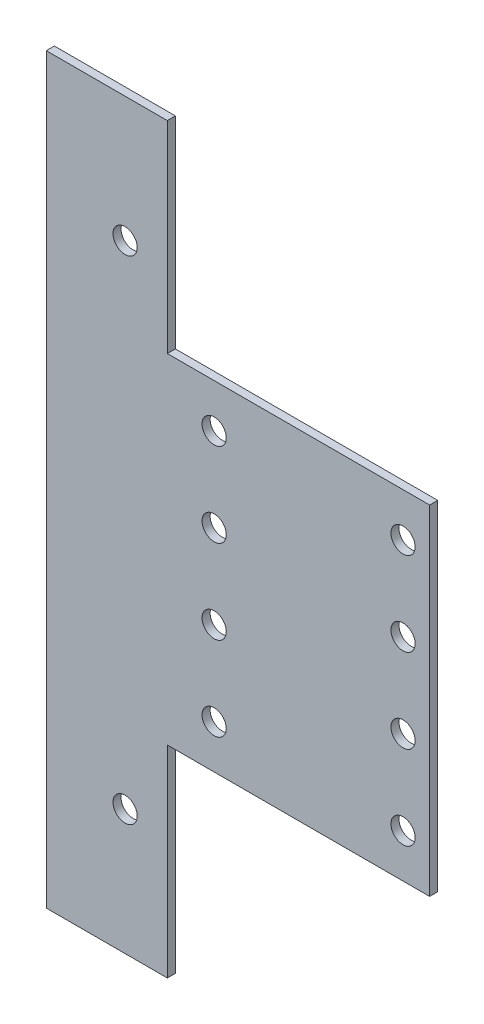
ISO-10303-21;
HEADER;
FILE_DESCRIPTION(('STEP AP214'),'2;1');
FILE_NAME('part.step','',(''),(''),'','','');
FILE_SCHEMA(('AUTOMOTIVE_DESIGN { 1 0 10303 214 1 1 1 1 }'));
ENDSEC;
DATA;
#1=APPLICATION_CONTEXT('core data for automotive mechanical design processes');
#2=APPLICATION_PROTOCOL_DEFINITION('international standard','automotive_design',2000,#1);
#3=PRODUCT_CONTEXT('',#1,'mechanical');
#4=PRODUCT('Part','Part','',(#3));
#5=PRODUCT_RELATED_PRODUCT_CATEGORY('part','',(#4));
#6=PRODUCT_DEFINITION_FORMATION('','',#4);
#7=PRODUCT_DEFINITION_CONTEXT('part definition',#1,'design');
#8=PRODUCT_DEFINITION('design','',#6,#7);
#9=PRODUCT_DEFINITION_SHAPE('','',#8);
#10=(LENGTH_UNIT() NAMED_UNIT(*) SI_UNIT(.MILLI.,.METRE.));
#11=(NAMED_UNIT(*) PLANE_ANGLE_UNIT() SI_UNIT($,.RADIAN.));
#12=(NAMED_UNIT(*) SI_UNIT($,.STERADIAN.) SOLID_ANGLE_UNIT());
#13=UNCERTAINTY_MEASURE_WITH_UNIT(LENGTH_MEASURE(1.E-05),#10,'distance_accuracy_value','');
#14=(GEOMETRIC_REPRESENTATION_CONTEXT(3) GLOBAL_UNCERTAINTY_ASSIGNED_CONTEXT((#13)) GLOBAL_UNIT_ASSIGNED_CONTEXT((#10,
#11,#12)) REPRESENTATION_CONTEXT('',''));
#15=CARTESIAN_POINT('',(0.,0.,0.));
#16=DIRECTION('',(0.,0.,1.));
#17=DIRECTION('',(1.,0.,0.));
#18=AXIS2_PLACEMENT_3D('',#15,#16,#17);
#19=CARTESIAN_POINT('',(0.,0.,1.));
#20=DIRECTION('',(0.,0.,-1.));
#21=DIRECTION('',(-1.,0.,0.));
#22=AXIS2_PLACEMENT_3D('',#19,#20,#21);
#23=PLANE('',#22);
#24=DIRECTION('',(-1.,0.,0.));
#25=VECTOR('',#24,1.);
#26=CARTESIAN_POINT('',(23.75,21.,1.));
#27=LINE('',#26,#25);
#28=CARTESIAN_POINT('',(23.75,21.,1.));
#29=VERTEX_POINT('',#28);
#30=CARTESIAN_POINT('',(-8.74999999999999,21.,1.));
#31=VERTEX_POINT('',#30);
#32=EDGE_CURVE('E145',#29,#31,#27,.T.);
#33=ORIENTED_EDGE('',*,*,#32,.T.);
#34=DIRECTION('',(0.,1.,0.));
#35=VECTOR('',#34,1.);
#36=CARTESIAN_POINT('',(-8.74999999999999,21.,1.));
#37=LINE('',#36,#35);
#38=CARTESIAN_POINT('',(-8.74999999999999,46.,1.));
#39=VERTEX_POINT('',#38);
#40=EDGE_CURVE('E93',#31,#39,#37,.T.);
#41=ORIENTED_EDGE('',*,*,#40,.T.);
#42=DIRECTION('',(-1.,0.,0.));
#43=VECTOR('',#42,1.);
#44=CARTESIAN_POINT('',(-8.74999999999999,46.,1.));
#45=LINE('',#44,#43);
#46=CARTESIAN_POINT('',(-23.75,46.,1.));
#47=VERTEX_POINT('',#46);
#48=EDGE_CURVE('E160',#39,#47,#45,.T.);
#49=ORIENTED_EDGE('',*,*,#48,.T.);
#50=DIRECTION('',(0.,-1.,0.));
#51=VECTOR('',#50,1.);
#52=CARTESIAN_POINT('',(-23.75,46.,1.));
#53=LINE('',#52,#51);
#54=CARTESIAN_POINT('',(-23.75,-46.,1.));
#55=VERTEX_POINT('',#54);
#56=EDGE_CURVE('E173',#47,#55,#53,.T.);
#57=ORIENTED_EDGE('',*,*,#56,.T.);
#58=DIRECTION('',(1.,0.,0.));
#59=VECTOR('',#58,1.);
#60=CARTESIAN_POINT('',(-23.75,-46.,1.));
#61=LINE('',#60,#59);
#62=CARTESIAN_POINT('',(-8.74999999999999,-46.,1.));
#63=VERTEX_POINT('',#62);
#64=EDGE_CURVE('E112',#55,#63,#61,.T.);
#65=ORIENTED_EDGE('',*,*,#64,.T.);
#66=DIRECTION('',(0.,1.,0.));
#67=VECTOR('',#66,1.);
#68=CARTESIAN_POINT('',(-8.74999999999999,-46.,1.));
#69=LINE('',#68,#67);
#70=CARTESIAN_POINT('',(-8.74999999999999,-21.,1.));
#71=VERTEX_POINT('',#70);
#72=EDGE_CURVE('E106',#63,#71,#69,.T.);
#73=ORIENTED_EDGE('',*,*,#72,.T.);
#74=DIRECTION('',(1.,0.,0.));
#75=VECTOR('',#74,1.);
#76=CARTESIAN_POINT('',(-8.74999999999999,-21.,1.));
#77=LINE('',#76,#75);
#78=CARTESIAN_POINT('',(23.75,-21.,1.));
#79=VERTEX_POINT('',#78);
#80=EDGE_CURVE('E110',#71,#79,#77,.T.);
#81=ORIENTED_EDGE('',*,*,#80,.T.);
#82=DIRECTION('',(0.,1.,0.));
#83=VECTOR('',#82,1.);
#84=CARTESIAN_POINT('',(23.75,-21.,1.));
#85=LINE('',#84,#83);
#86=EDGE_CURVE('E50',#79,#29,#85,.T.);
#87=ORIENTED_EDGE('',*,*,#86,.T.);
#88=EDGE_LOOP('',(#33,#41,#49,#57,#65,#73,#81,#87));
#89=FACE_BOUND('',#88,.T.);
#90=CARTESIAN_POINT('',(-13.9867023110329,30.5,1.));
#91=DIRECTION('',(0.,0.,1.));
#92=DIRECTION('',(1.,0.,0.));
#93=AXIS2_PLACEMENT_3D('',#90,#91,#92);
#94=CIRCLE('',#93,1.5);
#95=CARTESIAN_POINT('',(-12.4867023110329,30.5,1.));
#96=VERTEX_POINT('',#95);
#97=EDGE_CURVE('E134',#96,#96,#94,.T.);
#98=ORIENTED_EDGE('',*,*,#97,.F.);
#99=EDGE_LOOP('',(#98));
#100=FACE_BOUND('',#99,.T.);
#101=CARTESIAN_POINT('',(-13.9867023110329,-30.5,1.));
#102=DIRECTION('',(0.,0.,1.));
#103=DIRECTION('',(1.,0.,0.));
#104=AXIS2_PLACEMENT_3D('',#101,#102,#103);
#105=CIRCLE('',#104,1.5);
#106=CARTESIAN_POINT('',(-12.4867023110329,-30.5,1.));
#107=VERTEX_POINT('',#106);
#108=EDGE_CURVE('E182',#107,#107,#105,.T.);
#109=ORIENTED_EDGE('',*,*,#108,.F.);
#110=EDGE_LOOP('',(#109));
#111=FACE_BOUND('',#110,.T.);
#112=CARTESIAN_POINT('',(-2.94999999999999,-15.6,1.));
#113=DIRECTION('',(0.,0.,1.));
#114=DIRECTION('',(1.,0.,0.));
#115=AXIS2_PLACEMENT_3D('',#112,#113,#114);
#116=CIRCLE('',#115,1.5);
#117=CARTESIAN_POINT('',(-1.44999999999999,-15.6,1.));
#118=VERTEX_POINT('',#117);
#119=EDGE_CURVE('E188',#118,#118,#116,.T.);
#120=ORIENTED_EDGE('',*,*,#119,.F.);
#121=EDGE_LOOP('',(#120));
#122=FACE_BOUND('',#121,.T.);
#123=CARTESIAN_POINT('',(-2.94999999999999,-5.19999999999999,1.));
#124=DIRECTION('',(0.,0.,1.));
#125=DIRECTION('',(1.,0.,0.));
#126=AXIS2_PLACEMENT_3D('',#123,#124,#125);
#127=CIRCLE('',#126,1.5);
#128=CARTESIAN_POINT('',(-1.44999999999999,-5.19999999999999,1.));
#129=VERTEX_POINT('',#128);
#130=EDGE_CURVE('E194',#129,#129,#127,.T.);
#131=ORIENTED_EDGE('',*,*,#130,.F.);
#132=EDGE_LOOP('',(#131));
#133=FACE_BOUND('',#132,.T.);
#134=CARTESIAN_POINT('',(-2.94999999999999,5.20000000000001,1.));
#135=DIRECTION('',(0.,0.,1.));
#136=DIRECTION('',(1.,0.,0.));
#137=AXIS2_PLACEMENT_3D('',#134,#135,#136);
#138=CIRCLE('',#137,1.5);
#139=CARTESIAN_POINT('',(-1.44999999999999,5.20000000000001,1.));
#140=VERTEX_POINT('',#139);
#141=EDGE_CURVE('E200',#140,#140,#138,.T.);
#142=ORIENTED_EDGE('',*,*,#141,.F.);
#143=EDGE_LOOP('',(#142));
#144=FACE_BOUND('',#143,.T.);
#145=CARTESIAN_POINT('',(-2.94999999999999,15.6,1.));
#146=DIRECTION('',(0.,0.,1.));
#147=DIRECTION('',(1.,0.,0.));
#148=AXIS2_PLACEMENT_3D('',#145,#146,#147);
#149=CIRCLE('',#148,1.5);
#150=CARTESIAN_POINT('',(-1.44999999999999,15.6,1.));
#151=VERTEX_POINT('',#150);
#152=EDGE_CURVE('E206',#151,#151,#149,.T.);
#153=ORIENTED_EDGE('',*,*,#152,.F.);
#154=EDGE_LOOP('',(#153));
#155=FACE_BOUND('',#154,.T.);
#156=CARTESIAN_POINT('',(20.45,15.6,1.));
#157=DIRECTION('',(0.,0.,1.));
#158=DIRECTION('',(1.,0.,0.));
#159=AXIS2_PLACEMENT_3D('',#156,#157,#158);
#160=CIRCLE('',#159,1.5);
#161=CARTESIAN_POINT('',(21.95,15.6,1.));
#162=VERTEX_POINT('',#161);
#163=EDGE_CURVE('E212',#162,#162,#160,.T.);
#164=ORIENTED_EDGE('',*,*,#163,.F.);
#165=EDGE_LOOP('',(#164));
#166=FACE_BOUND('',#165,.T.);
#167=CARTESIAN_POINT('',(20.45,5.2,1.));
#168=DIRECTION('',(0.,0.,1.));
#169=DIRECTION('',(1.,0.,0.));
#170=AXIS2_PLACEMENT_3D('',#167,#168,#169);
#171=CIRCLE('',#170,1.5);
#172=CARTESIAN_POINT('',(21.95,5.2,1.));
#173=VERTEX_POINT('',#172);
#174=EDGE_CURVE('E218',#173,#173,#171,.T.);
#175=ORIENTED_EDGE('',*,*,#174,.F.);
#176=EDGE_LOOP('',(#175));
#177=FACE_BOUND('',#176,.T.);
#178=CARTESIAN_POINT('',(20.45,-5.2,1.));
#179=DIRECTION('',(0.,0.,1.));
#180=DIRECTION('',(1.,0.,0.));
#181=AXIS2_PLACEMENT_3D('',#178,#179,#180);
#182=CIRCLE('',#181,1.5);
#183=CARTESIAN_POINT('',(21.95,-5.2,1.));
#184=VERTEX_POINT('',#183);
#185=EDGE_CURVE('E224',#184,#184,#182,.T.);
#186=ORIENTED_EDGE('',*,*,#185,.F.);
#187=EDGE_LOOP('',(#186));
#188=FACE_BOUND('',#187,.T.);
#189=CARTESIAN_POINT('',(20.45,-15.6,1.));
#190=DIRECTION('',(0.,0.,1.));
#191=DIRECTION('',(1.,0.,0.));
#192=AXIS2_PLACEMENT_3D('',#189,#190,#191);
#193=CIRCLE('',#192,1.5);
#194=CARTESIAN_POINT('',(21.95,-15.6,1.));
#195=VERTEX_POINT('',#194);
#196=EDGE_CURVE('E230',#195,#195,#193,.T.);
#197=ORIENTED_EDGE('',*,*,#196,.F.);
#198=EDGE_LOOP('',(#197));
#199=FACE_BOUND('',#198,.T.);
#200=ADVANCED_FACE('F33',(#89,#100,#111,#122,#133,#144,#155,#166,#177,#188,#199),#23,.F.);
#201=CARTESIAN_POINT('',(0.,0.,0.));
#202=DIRECTION('',(0.,0.,-1.));
#203=DIRECTION('',(-1.,0.,0.));
#204=AXIS2_PLACEMENT_3D('',#201,#202,#203);
#205=PLANE('',#204);
#206=CARTESIAN_POINT('',(20.45,-5.2,0.));
#207=DIRECTION('',(0.,0.,1.));
#208=DIRECTION('',(1.,0.,0.));
#209=AXIS2_PLACEMENT_3D('',#206,#207,#208);
#210=CIRCLE('',#209,1.5);
#211=CARTESIAN_POINT('',(21.95,-5.2,0.));
#212=VERTEX_POINT('',#211);
#213=EDGE_CURVE('E227',#212,#212,#210,.T.);
#214=ORIENTED_EDGE('',*,*,#213,.T.);
#215=EDGE_LOOP('',(#214));
#216=FACE_BOUND('',#215,.T.);
#217=CARTESIAN_POINT('',(20.45,15.6,0.));
#218=DIRECTION('',(0.,0.,1.));
#219=DIRECTION('',(1.,0.,0.));
#220=AXIS2_PLACEMENT_3D('',#217,#218,#219);
#221=CIRCLE('',#220,1.5);
#222=CARTESIAN_POINT('',(21.95,15.6,0.));
#223=VERTEX_POINT('',#222);
#224=EDGE_CURVE('E215',#223,#223,#221,.T.);
#225=ORIENTED_EDGE('',*,*,#224,.T.);
#226=EDGE_LOOP('',(#225));
#227=FACE_BOUND('',#226,.T.);
#228=CARTESIAN_POINT('',(-2.94999999999999,5.20000000000001,0.));
#229=DIRECTION('',(0.,0.,1.));
#230=DIRECTION('',(1.,0.,0.));
#231=AXIS2_PLACEMENT_3D('',#228,#229,#230);
#232=CIRCLE('',#231,1.5);
#233=CARTESIAN_POINT('',(-1.44999999999999,5.20000000000001,0.));
#234=VERTEX_POINT('',#233);
#235=EDGE_CURVE('E203',#234,#234,#232,.T.);
#236=ORIENTED_EDGE('',*,*,#235,.T.);
#237=EDGE_LOOP('',(#236));
#238=FACE_BOUND('',#237,.T.);
#239=CARTESIAN_POINT('',(-2.94999999999999,-15.6,0.));
#240=DIRECTION('',(0.,0.,1.));
#241=DIRECTION('',(1.,0.,0.));
#242=AXIS2_PLACEMENT_3D('',#239,#240,#241);
#243=CIRCLE('',#242,1.5);
#244=CARTESIAN_POINT('',(-1.44999999999999,-15.6,0.));
#245=VERTEX_POINT('',#244);
#246=EDGE_CURVE('E191',#245,#245,#243,.T.);
#247=ORIENTED_EDGE('',*,*,#246,.T.);
#248=EDGE_LOOP('',(#247));
#249=FACE_BOUND('',#248,.T.);
#250=CARTESIAN_POINT('',(-13.9867023110329,30.5,0.));
#251=DIRECTION('',(0.,0.,1.));
#252=DIRECTION('',(1.,0.,0.));
#253=AXIS2_PLACEMENT_3D('',#250,#251,#252);
#254=CIRCLE('',#253,1.5);
#255=CARTESIAN_POINT('',(-12.4867023110329,30.5,0.));
#256=VERTEX_POINT('',#255);
#257=EDGE_CURVE('E179',#256,#256,#254,.T.);
#258=ORIENTED_EDGE('',*,*,#257,.T.);
#259=EDGE_LOOP('',(#258));
#260=FACE_BOUND('',#259,.T.);
#261=DIRECTION('',(-1.,0.,0.));
#262=VECTOR('',#261,1.);
#263=CARTESIAN_POINT('',(23.75,21.,0.));
#264=LINE('',#263,#262);
#265=CARTESIAN_POINT('',(23.75,21.,0.));
#266=VERTEX_POINT('',#265);
#267=CARTESIAN_POINT('',(-8.74999999999999,21.,0.));
#268=VERTEX_POINT('',#267);
#269=EDGE_CURVE('E130',#266,#268,#264,.T.);
#270=ORIENTED_EDGE('',*,*,#269,.F.);
#271=DIRECTION('',(0.,1.,0.));
#272=VECTOR('',#271,1.);
#273=CARTESIAN_POINT('',(23.75,-21.,0.));
#274=LINE('',#273,#272);
#275=CARTESIAN_POINT('',(23.75,-21.,0.));
#276=VERTEX_POINT('',#275);
#277=EDGE_CURVE('E85',#276,#266,#274,.T.);
#278=ORIENTED_EDGE('',*,*,#277,.F.);
#279=DIRECTION('',(1.,0.,0.));
#280=VECTOR('',#279,1.);
#281=CARTESIAN_POINT('',(-8.74999999999999,-21.,0.));
#282=LINE('',#281,#280);
#283=CARTESIAN_POINT('',(-8.74999999999999,-21.,0.));
#284=VERTEX_POINT('',#283);
#285=EDGE_CURVE('E79',#284,#276,#282,.T.);
#286=ORIENTED_EDGE('',*,*,#285,.F.);
#287=DIRECTION('',(0.,1.,0.));
#288=VECTOR('',#287,1.);
#289=CARTESIAN_POINT('',(-8.74999999999999,-46.,0.));
#290=LINE('',#289,#288);
#291=CARTESIAN_POINT('',(-8.74999999999999,-46.,0.));
#292=VERTEX_POINT('',#291);
#293=EDGE_CURVE('E120',#292,#284,#290,.T.);
#294=ORIENTED_EDGE('',*,*,#293,.F.);
#295=DIRECTION('',(1.,0.,0.));
#296=VECTOR('',#295,1.);
#297=CARTESIAN_POINT('',(-23.75,-46.,0.));
#298=LINE('',#297,#296);
#299=CARTESIAN_POINT('',(-23.75,-46.,0.));
#300=VERTEX_POINT('',#299);
#301=EDGE_CURVE('E140',#300,#292,#298,.T.);
#302=ORIENTED_EDGE('',*,*,#301,.F.);
#303=DIRECTION('',(0.,-1.,0.));
#304=VECTOR('',#303,1.);
#305=CARTESIAN_POINT('',(-23.75,46.,0.));
#306=LINE('',#305,#304);
#307=CARTESIAN_POINT('',(-23.75,46.,0.));
#308=VERTEX_POINT('',#307);
#309=EDGE_CURVE('E138',#308,#300,#306,.T.);
#310=ORIENTED_EDGE('',*,*,#309,.F.);
#311=DIRECTION('',(-1.,0.,0.));
#312=VECTOR('',#311,1.);
#313=CARTESIAN_POINT('',(-8.74999999999999,46.,0.));
#314=LINE('',#313,#312);
#315=CARTESIAN_POINT('',(-8.74999999999999,46.,0.));
#316=VERTEX_POINT('',#315);
#317=EDGE_CURVE('E136',#316,#308,#314,.T.);
#318=ORIENTED_EDGE('',*,*,#317,.F.);
#319=DIRECTION('',(0.,1.,0.));
#320=VECTOR('',#319,1.);
#321=CARTESIAN_POINT('',(-8.74999999999999,21.,0.));
#322=LINE('',#321,#320);
#323=EDGE_CURVE('E133',#268,#316,#322,.T.);
#324=ORIENTED_EDGE('',*,*,#323,.F.);
#325=EDGE_LOOP('',(#270,#278,#286,#294,#302,#310,#318,#324));
#326=FACE_BOUND('',#325,.T.);
#327=CARTESIAN_POINT('',(-13.9867023110329,-30.5,0.));
#328=DIRECTION('',(0.,0.,1.));
#329=DIRECTION('',(1.,0.,0.));
#330=AXIS2_PLACEMENT_3D('',#327,#328,#329);
#331=CIRCLE('',#330,1.5);
#332=CARTESIAN_POINT('',(-12.4867023110329,-30.5,0.));
#333=VERTEX_POINT('',#332);
#334=EDGE_CURVE('E185',#333,#333,#331,.T.);
#335=ORIENTED_EDGE('',*,*,#334,.T.);
#336=EDGE_LOOP('',(#335));
#337=FACE_BOUND('',#336,.T.);
#338=CARTESIAN_POINT('',(-2.94999999999999,-5.19999999999999,0.));
#339=DIRECTION('',(0.,0.,1.));
#340=DIRECTION('',(1.,0.,0.));
#341=AXIS2_PLACEMENT_3D('',#338,#339,#340);
#342=CIRCLE('',#341,1.5);
#343=CARTESIAN_POINT('',(-1.44999999999999,-5.19999999999999,0.));
#344=VERTEX_POINT('',#343);
#345=EDGE_CURVE('E197',#344,#344,#342,.T.);
#346=ORIENTED_EDGE('',*,*,#345,.T.);
#347=EDGE_LOOP('',(#346));
#348=FACE_BOUND('',#347,.T.);
#349=CARTESIAN_POINT('',(-2.94999999999999,15.6,0.));
#350=DIRECTION('',(0.,0.,1.));
#351=DIRECTION('',(1.,0.,0.));
#352=AXIS2_PLACEMENT_3D('',#349,#350,#351);
#353=CIRCLE('',#352,1.5);
#354=CARTESIAN_POINT('',(-1.44999999999999,15.6,0.));
#355=VERTEX_POINT('',#354);
#356=EDGE_CURVE('E209',#355,#355,#353,.T.);
#357=ORIENTED_EDGE('',*,*,#356,.T.);
#358=EDGE_LOOP('',(#357));
#359=FACE_BOUND('',#358,.T.);
#360=CARTESIAN_POINT('',(20.45,5.2,0.));
#361=DIRECTION('',(0.,0.,1.));
#362=DIRECTION('',(1.,0.,0.));
#363=AXIS2_PLACEMENT_3D('',#360,#361,#362);
#364=CIRCLE('',#363,1.5);
#365=CARTESIAN_POINT('',(21.95,5.2,0.));
#366=VERTEX_POINT('',#365);
#367=EDGE_CURVE('E221',#366,#366,#364,.T.);
#368=ORIENTED_EDGE('',*,*,#367,.T.);
#369=EDGE_LOOP('',(#368));
#370=FACE_BOUND('',#369,.T.);
#371=CARTESIAN_POINT('',(20.45,-15.6,0.));
#372=DIRECTION('',(0.,0.,1.));
#373=DIRECTION('',(1.,0.,0.));
#374=AXIS2_PLACEMENT_3D('',#371,#372,#373);
#375=CIRCLE('',#374,1.5);
#376=CARTESIAN_POINT('',(21.95,-15.6,0.));
#377=VERTEX_POINT('',#376);
#378=EDGE_CURVE('E233',#377,#377,#375,.T.);
#379=ORIENTED_EDGE('',*,*,#378,.T.);
#380=EDGE_LOOP('',(#379));
#381=FACE_BOUND('',#380,.T.);
#382=ADVANCED_FACE('F164',(#216,#227,#238,#249,#260,#326,#337,#348,#359,#370,#381),#205,.T.);
#383=CARTESIAN_POINT('',(23.75,21.,1.));
#384=DIRECTION('',(0.,-1.,0.));
#385=DIRECTION('',(0.,0.,-1.));
#386=AXIS2_PLACEMENT_3D('',#383,#384,#385);
#387=PLANE('',#386);
#388=ORIENTED_EDGE('',*,*,#269,.T.);
#389=DIRECTION('',(0.,0.,-1.));
#390=VECTOR('',#389,1.);
#391=CARTESIAN_POINT('',(-8.74999999999999,21.,1.));
#392=LINE('',#391,#390);
#393=EDGE_CURVE('E11',#31,#268,#392,.T.);
#394=ORIENTED_EDGE('',*,*,#393,.F.);
#395=ORIENTED_EDGE('',*,*,#32,.F.);
#396=DIRECTION('',(0.,0.,-1.));
#397=VECTOR('',#396,1.);
#398=CARTESIAN_POINT('',(23.75,21.,1.));
#399=LINE('',#398,#397);
#400=EDGE_CURVE('E126',#29,#266,#399,.T.);
#401=ORIENTED_EDGE('',*,*,#400,.T.);
#402=EDGE_LOOP('',(#388,#394,#395,#401));
#403=FACE_BOUND('',#402,.T.);
#404=ADVANCED_FACE('F35',(#403),#387,.F.);
#405=CARTESIAN_POINT('',(-8.74999999999999,21.,1.));
#406=DIRECTION('',(-1.,0.,0.));
#407=DIRECTION('',(0.,0.,1.));
#408=AXIS2_PLACEMENT_3D('',#405,#406,#407);
#409=PLANE('',#408);
#410=ORIENTED_EDGE('',*,*,#323,.T.);
#411=DIRECTION('',(0.,0.,-1.));
#412=VECTOR('',#411,1.);
#413=CARTESIAN_POINT('',(-8.74999999999999,46.,1.));
#414=LINE('',#413,#412);
#415=EDGE_CURVE('E42',#39,#316,#414,.T.);
#416=ORIENTED_EDGE('',*,*,#415,.F.);
#417=ORIENTED_EDGE('',*,*,#40,.F.);
#418=ORIENTED_EDGE('',*,*,#393,.T.);
#419=EDGE_LOOP('',(#410,#416,#417,#418));
#420=FACE_BOUND('',#419,.T.);
#421=ADVANCED_FACE('F265',(#420),#409,.F.);
#422=CARTESIAN_POINT('',(-8.74999999999999,46.,1.));
#423=DIRECTION('',(0.,-1.,0.));
#424=DIRECTION('',(0.,0.,-1.));
#425=AXIS2_PLACEMENT_3D('',#422,#423,#424);
#426=PLANE('',#425);
#427=ORIENTED_EDGE('',*,*,#317,.T.);
#428=DIRECTION('',(0.,0.,-1.));
#429=VECTOR('',#428,1.);
#430=CARTESIAN_POINT('',(-23.75,46.,1.));
#431=LINE('',#430,#429);
#432=EDGE_CURVE('E152',#47,#308,#431,.T.);
#433=ORIENTED_EDGE('',*,*,#432,.F.);
#434=ORIENTED_EDGE('',*,*,#48,.F.);
#435=ORIENTED_EDGE('',*,*,#415,.T.);
#436=EDGE_LOOP('',(#427,#433,#434,#435));
#437=FACE_BOUND('',#436,.T.);
#438=ADVANCED_FACE('F158',(#437),#426,.F.);
#439=CARTESIAN_POINT('',(-23.75,46.,1.));
#440=DIRECTION('',(1.,0.,0.));
#441=DIRECTION('',(0.,0.,-1.));
#442=AXIS2_PLACEMENT_3D('',#439,#440,#441);
#443=PLANE('',#442);
#444=ORIENTED_EDGE('',*,*,#309,.T.);
#445=DIRECTION('',(0.,0.,-1.));
#446=VECTOR('',#445,1.);
#447=CARTESIAN_POINT('',(-23.75,-46.,1.));
#448=LINE('',#447,#446);
#449=EDGE_CURVE('E149',#55,#300,#448,.T.);
#450=ORIENTED_EDGE('',*,*,#449,.F.);
#451=ORIENTED_EDGE('',*,*,#56,.F.);
#452=ORIENTED_EDGE('',*,*,#432,.T.);
#453=EDGE_LOOP('',(#444,#450,#451,#452));
#454=FACE_BOUND('',#453,.T.);
#455=ADVANCED_FACE('F169',(#454),#443,.F.);
#456=CARTESIAN_POINT('',(-23.75,-46.,1.));
#457=DIRECTION('',(0.,1.,0.));
#458=DIRECTION('',(0.,0.,1.));
#459=AXIS2_PLACEMENT_3D('',#456,#457,#458);
#460=PLANE('',#459);
#461=ORIENTED_EDGE('',*,*,#301,.T.);
#462=DIRECTION('',(0.,0.,-1.));
#463=VECTOR('',#462,1.);
#464=CARTESIAN_POINT('',(-8.74999999999999,-46.,1.));
#465=LINE('',#464,#463);
#466=EDGE_CURVE('E121',#63,#292,#465,.T.);
#467=ORIENTED_EDGE('',*,*,#466,.F.);
#468=ORIENTED_EDGE('',*,*,#64,.F.);
#469=ORIENTED_EDGE('',*,*,#449,.T.);
#470=EDGE_LOOP('',(#461,#467,#468,#469));
#471=FACE_BOUND('',#470,.T.);
#472=ADVANCED_FACE('F172',(#471),#460,.F.);
#473=CARTESIAN_POINT('',(-8.74999999999999,-46.,1.));
#474=DIRECTION('',(-1.,0.,0.));
#475=DIRECTION('',(0.,-1.,0.));
#476=AXIS2_PLACEMENT_3D('',#473,#474,#475);
#477=PLANE('',#476);
#478=ORIENTED_EDGE('',*,*,#293,.T.);
#479=DIRECTION('',(0.,0.,-1.));
#480=VECTOR('',#479,1.);
#481=CARTESIAN_POINT('',(-8.74999999999999,-21.,1.));
#482=LINE('',#481,#480);
#483=EDGE_CURVE('E117',#71,#284,#482,.T.);
#484=ORIENTED_EDGE('',*,*,#483,.F.);
#485=ORIENTED_EDGE('',*,*,#72,.F.);
#486=ORIENTED_EDGE('',*,*,#466,.T.);
#487=EDGE_LOOP('',(#478,#484,#485,#486));
#488=FACE_BOUND('',#487,.T.);
#489=ADVANCED_FACE('F118',(#488),#477,.F.);
#490=CARTESIAN_POINT('',(-8.74999999999999,-21.,1.));
#491=DIRECTION('',(0.,1.,0.));
#492=DIRECTION('',(-1.,0.,0.));
#493=AXIS2_PLACEMENT_3D('',#490,#491,#492);
#494=PLANE('',#493);
#495=ORIENTED_EDGE('',*,*,#285,.T.);
#496=DIRECTION('',(0.,0.,-1.));
#497=VECTOR('',#496,1.);
#498=CARTESIAN_POINT('',(23.75,-21.,1.));
#499=LINE('',#498,#497);
#500=EDGE_CURVE('E122',#79,#276,#499,.T.);
#501=ORIENTED_EDGE('',*,*,#500,.F.);
#502=ORIENTED_EDGE('',*,*,#80,.F.);
#503=ORIENTED_EDGE('',*,*,#483,.T.);
#504=EDGE_LOOP('',(#495,#501,#502,#503));
#505=FACE_BOUND('',#504,.T.);
#506=ADVANCED_FACE('F124',(#505),#494,.F.);
#507=CARTESIAN_POINT('',(23.75,-21.,1.));
#508=DIRECTION('',(-1.,0.,0.));
#509=DIRECTION('',(0.,0.,1.));
#510=AXIS2_PLACEMENT_3D('',#507,#508,#509);
#511=PLANE('',#510);
#512=ORIENTED_EDGE('',*,*,#277,.T.);
#513=ORIENTED_EDGE('',*,*,#400,.F.);
#514=ORIENTED_EDGE('',*,*,#86,.F.);
#515=ORIENTED_EDGE('',*,*,#500,.T.);
#516=EDGE_LOOP('',(#512,#513,#514,#515));
#517=FACE_BOUND('',#516,.T.);
#518=ADVANCED_FACE('F253',(#517),#511,.F.);
#519=CARTESIAN_POINT('',(-13.9867023110329,30.5,1.));
#520=DIRECTION('',(0.,0.,-1.));
#521=DIRECTION('',(-1.,0.,0.));
#522=AXIS2_PLACEMENT_3D('',#519,#520,#521);
#523=CYLINDRICAL_SURFACE('',#522,1.5);
#524=ORIENTED_EDGE('',*,*,#97,.T.);
#525=EDGE_LOOP('',(#524));
#526=FACE_BOUND('',#525,.T.);
#527=ORIENTED_EDGE('',*,*,#257,.F.);
#528=EDGE_LOOP('',(#527));
#529=FACE_BOUND('',#528,.T.);
#530=ADVANCED_FACE('F250',(#526,#529),#523,.F.);
#531=CARTESIAN_POINT('',(-13.9867023110329,-30.5,1.));
#532=DIRECTION('',(0.,0.,-1.));
#533=DIRECTION('',(-1.,0.,0.));
#534=AXIS2_PLACEMENT_3D('',#531,#532,#533);
#535=CYLINDRICAL_SURFACE('',#534,1.5);
#536=ORIENTED_EDGE('',*,*,#108,.T.);
#537=EDGE_LOOP('',(#536));
#538=FACE_BOUND('',#537,.T.);
#539=ORIENTED_EDGE('',*,*,#334,.F.);
#540=EDGE_LOOP('',(#539));
#541=FACE_BOUND('',#540,.T.);
#542=ADVANCED_FACE('F329',(#538,#541),#535,.F.);
#543=CARTESIAN_POINT('',(-2.94999999999999,-15.6,1.));
#544=DIRECTION('',(0.,0.,-1.));
#545=DIRECTION('',(-1.,0.,0.));
#546=AXIS2_PLACEMENT_3D('',#543,#544,#545);
#547=CYLINDRICAL_SURFACE('',#546,1.5);
#548=ORIENTED_EDGE('',*,*,#119,.T.);
#549=EDGE_LOOP('',(#548));
#550=FACE_BOUND('',#549,.T.);
#551=ORIENTED_EDGE('',*,*,#246,.F.);
#552=EDGE_LOOP('',(#551));
#553=FACE_BOUND('',#552,.T.);
#554=ADVANCED_FACE('F337',(#550,#553),#547,.F.);
#555=CARTESIAN_POINT('',(-2.94999999999999,-5.19999999999999,1.));
#556=DIRECTION('',(0.,0.,-1.));
#557=DIRECTION('',(-1.,0.,0.));
#558=AXIS2_PLACEMENT_3D('',#555,#556,#557);
#559=CYLINDRICAL_SURFACE('',#558,1.5);
#560=ORIENTED_EDGE('',*,*,#130,.T.);
#561=EDGE_LOOP('',(#560));
#562=FACE_BOUND('',#561,.T.);
#563=ORIENTED_EDGE('',*,*,#345,.F.);
#564=EDGE_LOOP('',(#563));
#565=FACE_BOUND('',#564,.T.);
#566=ADVANCED_FACE('F345',(#562,#565),#559,.F.);
#567=CARTESIAN_POINT('',(-2.94999999999999,5.20000000000001,1.));
#568=DIRECTION('',(0.,0.,-1.));
#569=DIRECTION('',(-1.,0.,0.));
#570=AXIS2_PLACEMENT_3D('',#567,#568,#569);
#571=CYLINDRICAL_SURFACE('',#570,1.5);
#572=ORIENTED_EDGE('',*,*,#141,.T.);
#573=EDGE_LOOP('',(#572));
#574=FACE_BOUND('',#573,.T.);
#575=ORIENTED_EDGE('',*,*,#235,.F.);
#576=EDGE_LOOP('',(#575));
#577=FACE_BOUND('',#576,.T.);
#578=ADVANCED_FACE('F354',(#574,#577),#571,.F.);
#579=CARTESIAN_POINT('',(-2.94999999999999,15.6,1.));
#580=DIRECTION('',(0.,0.,-1.));
#581=DIRECTION('',(-1.,0.,0.));
#582=AXIS2_PLACEMENT_3D('',#579,#580,#581);
#583=CYLINDRICAL_SURFACE('',#582,1.5);
#584=ORIENTED_EDGE('',*,*,#152,.T.);
#585=EDGE_LOOP('',(#584));
#586=FACE_BOUND('',#585,.T.);
#587=ORIENTED_EDGE('',*,*,#356,.F.);
#588=EDGE_LOOP('',(#587));
#589=FACE_BOUND('',#588,.T.);
#590=ADVANCED_FACE('F363',(#586,#589),#583,.F.);
#591=CARTESIAN_POINT('',(20.45,15.6,1.));
#592=DIRECTION('',(0.,0.,-1.));
#593=DIRECTION('',(-1.,0.,0.));
#594=AXIS2_PLACEMENT_3D('',#591,#592,#593);
#595=CYLINDRICAL_SURFACE('',#594,1.5);
#596=ORIENTED_EDGE('',*,*,#163,.T.);
#597=EDGE_LOOP('',(#596));
#598=FACE_BOUND('',#597,.T.);
#599=ORIENTED_EDGE('',*,*,#224,.F.);
#600=EDGE_LOOP('',(#599));
#601=FACE_BOUND('',#600,.T.);
#602=ADVANCED_FACE('F372',(#598,#601),#595,.F.);
#603=CARTESIAN_POINT('',(20.45,5.2,1.));
#604=DIRECTION('',(0.,0.,-1.));
#605=DIRECTION('',(-1.,0.,0.));
#606=AXIS2_PLACEMENT_3D('',#603,#604,#605);
#607=CYLINDRICAL_SURFACE('',#606,1.5);
#608=ORIENTED_EDGE('',*,*,#174,.T.);
#609=EDGE_LOOP('',(#608));
#610=FACE_BOUND('',#609,.T.);
#611=ORIENTED_EDGE('',*,*,#367,.F.);
#612=EDGE_LOOP('',(#611));
#613=FACE_BOUND('',#612,.T.);
#614=ADVANCED_FACE('F381',(#610,#613),#607,.F.);
#615=CARTESIAN_POINT('',(20.45,-5.2,1.));
#616=DIRECTION('',(0.,0.,-1.));
#617=DIRECTION('',(-1.,0.,0.));
#618=AXIS2_PLACEMENT_3D('',#615,#616,#617);
#619=CYLINDRICAL_SURFACE('',#618,1.5);
#620=ORIENTED_EDGE('',*,*,#185,.T.);
#621=EDGE_LOOP('',(#620));
#622=FACE_BOUND('',#621,.T.);
#623=ORIENTED_EDGE('',*,*,#213,.F.);
#624=EDGE_LOOP('',(#623));
#625=FACE_BOUND('',#624,.T.);
#626=ADVANCED_FACE('F390',(#622,#625),#619,.F.);
#627=CARTESIAN_POINT('',(20.45,-15.6,1.));
#628=DIRECTION('',(0.,0.,-1.));
#629=DIRECTION('',(-1.,0.,0.));
#630=AXIS2_PLACEMENT_3D('',#627,#628,#629);
#631=CYLINDRICAL_SURFACE('',#630,1.5);
#632=ORIENTED_EDGE('',*,*,#196,.T.);
#633=EDGE_LOOP('',(#632));
#634=FACE_BOUND('',#633,.T.);
#635=ORIENTED_EDGE('',*,*,#378,.F.);
#636=EDGE_LOOP('',(#635));
#637=FACE_BOUND('',#636,.T.);
#638=ADVANCED_FACE('F239',(#634,#637),#631,.F.);
#639=CLOSED_SHELL('',(#200,#382,#404,#421,#438,#455,#472,#489,#506,#518,#530,#542,#554,#566,
#578,#590,#602,#614,#626,#638));
#640=MANIFOLD_SOLID_BREP('B2',#639);
#641=ADVANCED_BREP_SHAPE_REPRESENTATION('',(#18,#640),#14);
#642=SHAPE_DEFINITION_REPRESENTATION(#9,#641);
ENDSEC;
END-ISO-10303-21;
